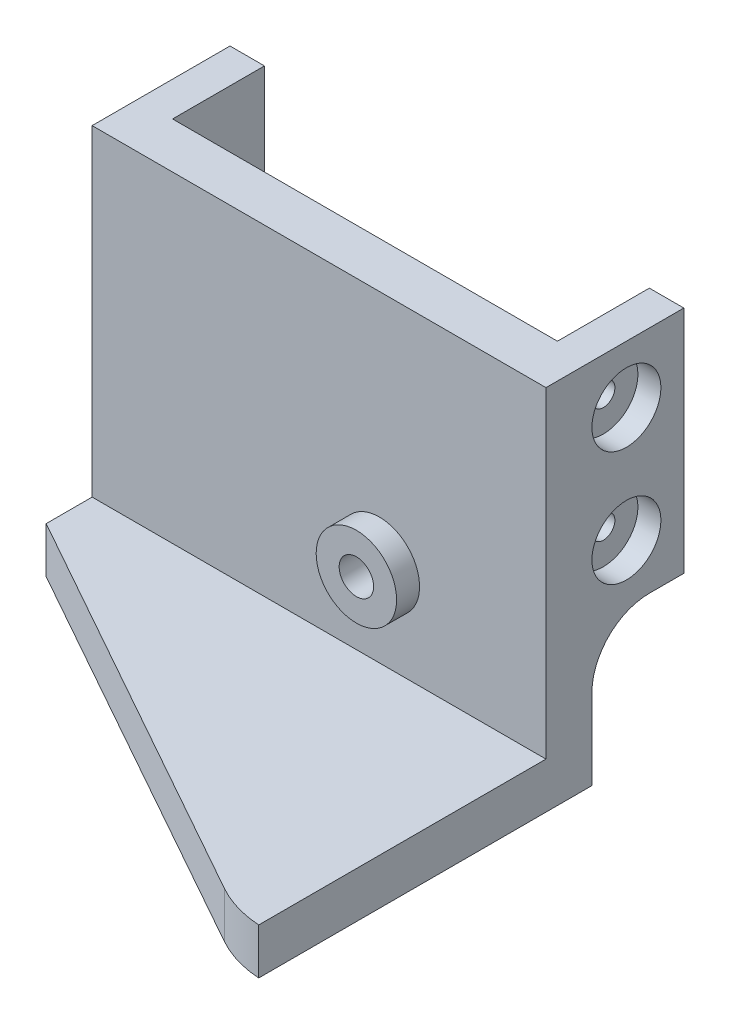
ISO-10303-21;
HEADER;
FILE_DESCRIPTION(('STEP AP214'),'2;1');
FILE_NAME('part.step','',(''),(''),'','','');
FILE_SCHEMA(('AUTOMOTIVE_DESIGN { 1 0 10303 214 1 1 1 1 }'));
ENDSEC;
DATA;
#1=APPLICATION_CONTEXT('core data for automotive mechanical design processes');
#2=APPLICATION_PROTOCOL_DEFINITION('international standard','automotive_design',2000,#1);
#3=PRODUCT_CONTEXT('',#1,'mechanical');
#4=PRODUCT('Part','Part','',(#3));
#5=PRODUCT_RELATED_PRODUCT_CATEGORY('part','',(#4));
#6=PRODUCT_DEFINITION_FORMATION('','',#4);
#7=PRODUCT_DEFINITION_CONTEXT('part definition',#1,'design');
#8=PRODUCT_DEFINITION('design','',#6,#7);
#9=PRODUCT_DEFINITION_SHAPE('','',#8);
#10=(LENGTH_UNIT() NAMED_UNIT(*) SI_UNIT(.MILLI.,.METRE.));
#11=(NAMED_UNIT(*) PLANE_ANGLE_UNIT() SI_UNIT($,.RADIAN.));
#12=(NAMED_UNIT(*) SI_UNIT($,.STERADIAN.) SOLID_ANGLE_UNIT());
#13=UNCERTAINTY_MEASURE_WITH_UNIT(LENGTH_MEASURE(1.E-05),#10,'distance_accuracy_value','');
#14=(GEOMETRIC_REPRESENTATION_CONTEXT(3) GLOBAL_UNCERTAINTY_ASSIGNED_CONTEXT((#13)) GLOBAL_UNIT_ASSIGNED_CONTEXT((#10,
#11,#12)) REPRESENTATION_CONTEXT('',''));
#15=CARTESIAN_POINT('',(0.,0.,0.));
#16=DIRECTION('',(0.,0.,1.));
#17=DIRECTION('',(1.,0.,0.));
#18=AXIS2_PLACEMENT_3D('',#15,#16,#17);
#19=CARTESIAN_POINT('',(37.5,20.,0.));
#20=DIRECTION('',(-1.,0.,0.));
#21=DIRECTION('',(0.,0.,1.));
#22=AXIS2_PLACEMENT_3D('',#19,#20,#21);
#23=PLANE('',#22);
#24=CARTESIAN_POINT('',(37.5,5.00000000000003,-6.99999999999992));
#25=DIRECTION('',(-1.,0.,0.));
#26=DIRECTION('',(0.,0.,1.));
#27=AXIS2_PLACEMENT_3D('',#24,#25,#26);
#28=CIRCLE('',#27,1.);
#29=CARTESIAN_POINT('',(37.5,5.00000000000003,-5.99999999999991));
#30=VERTEX_POINT('',#29);
#31=EDGE_CURVE('E205',#30,#30,#28,.T.);
#32=ORIENTED_EDGE('',*,*,#31,.T.);
#33=EDGE_LOOP('',(#32));
#34=FACE_BOUND('',#33,.T.);
#35=CARTESIAN_POINT('',(37.5,5.00000000000003,-6.9999999999999));
#36=DIRECTION('',(1.,0.,0.));
#37=DIRECTION('',(0.,0.,-1.));
#38=AXIS2_PLACEMENT_3D('',#35,#36,#37);
#39=CIRCLE('',#38,3.);
#40=CARTESIAN_POINT('',(37.5,5.00000000000003,-3.99999999999989));
#41=VERTEX_POINT('',#40);
#42=EDGE_CURVE('E196',#41,#41,#39,.T.);
#43=ORIENTED_EDGE('',*,*,#42,.T.);
#44=EDGE_LOOP('',(#43));
#45=FACE_BOUND('',#44,.T.);
#46=ADVANCED_FACE('F37',(#34,#45),#23,.F.);
#47=CARTESIAN_POINT('',(37.5,15.,-6.99999999999991));
#48=DIRECTION('',(-1.,0.,0.));
#49=DIRECTION('',(0.,0.,1.));
#50=AXIS2_PLACEMENT_3D('',#47,#48,#49);
#51=CIRCLE('',#50,1.);
#52=CARTESIAN_POINT('',(37.5,15.,-5.99999999999991));
#53=VERTEX_POINT('',#52);
#54=EDGE_CURVE('E214',#53,#53,#51,.T.);
#55=ORIENTED_EDGE('',*,*,#54,.T.);
#56=EDGE_LOOP('',(#55));
#57=FACE_BOUND('',#56,.T.);
#58=CARTESIAN_POINT('',(37.5,15.,-6.9999999999999));
#59=DIRECTION('',(1.,0.,0.));
#60=DIRECTION('',(0.,0.,-1.));
#61=AXIS2_PLACEMENT_3D('',#58,#59,#60);
#62=CIRCLE('',#61,3.);
#63=CARTESIAN_POINT('',(37.5,15.,-3.99999999999989));
#64=VERTEX_POINT('',#63);
#65=EDGE_CURVE('E199',#64,#64,#62,.T.);
#66=ORIENTED_EDGE('',*,*,#65,.T.);
#67=EDGE_LOOP('',(#66));
#68=FACE_BOUND('',#67,.T.);
#69=ADVANCED_FACE('F370',(#57,#68),#23,.F.);
#70=CARTESIAN_POINT('',(0.,0.,0.));
#71=DIRECTION('',(0.,1.,0.));
#72=DIRECTION('',(0.,0.,1.));
#73=AXIS2_PLACEMENT_3D('',#70,#71,#72);
#74=PLANE('',#73);
#75=DIRECTION('',(0.,0.,1.));
#76=VECTOR('',#75,1.);
#77=CARTESIAN_POINT('',(3.,0.,0.));
#78=LINE('',#77,#76);
#79=CARTESIAN_POINT('',(3.,0.,-12.));
#80=VERTEX_POINT('',#79);
#81=CARTESIAN_POINT('',(3.,0.,-9.));
#82=VERTEX_POINT('',#81);
#83=EDGE_CURVE('E266',#80,#82,#78,.T.);
#84=ORIENTED_EDGE('',*,*,#83,.T.);
#85=DIRECTION('',(1.,0.,0.));
#86=VECTOR('',#85,1.);
#87=CARTESIAN_POINT('',(0.,0.,-9.));
#88=LINE('',#87,#86);
#89=CARTESIAN_POINT('',(0.,0.,-9.));
#90=VERTEX_POINT('',#89);
#91=EDGE_CURVE('E287',#82,#90,#88,.F.);
#92=ORIENTED_EDGE('',*,*,#91,.T.);
#93=DIRECTION('',(0.,0.,-1.));
#94=VECTOR('',#93,1.);
#95=CARTESIAN_POINT('',(0.,0.,0.));
#96=LINE('',#95,#94);
#97=CARTESIAN_POINT('',(0.,0.,-12.));
#98=VERTEX_POINT('',#97);
#99=EDGE_CURVE('E251',#90,#98,#96,.T.);
#100=ORIENTED_EDGE('',*,*,#99,.T.);
#101=DIRECTION('',(1.,0.,0.));
#102=VECTOR('',#101,1.);
#103=CARTESIAN_POINT('',(0.,0.,-12.));
#104=LINE('',#103,#102);
#105=EDGE_CURVE('E263',#98,#80,#104,.T.);
#106=ORIENTED_EDGE('',*,*,#105,.T.);
#107=EDGE_LOOP('',(#84,#92,#100,#106));
#108=FACE_BOUND('',#107,.T.);
#109=ADVANCED_FACE('F333',(#108),#74,.F.);
#110=CARTESIAN_POINT('',(36.5,0.,-12.));
#111=VERTEX_POINT('',#110);
#112=CARTESIAN_POINT('',(39.5,0.,-12.));
#113=VERTEX_POINT('',#112);
#114=EDGE_CURVE('E247',#111,#113,#104,.T.);
#115=ORIENTED_EDGE('',*,*,#114,.T.);
#116=DIRECTION('',(0.,0.,-1.));
#117=VECTOR('',#116,1.);
#118=CARTESIAN_POINT('',(39.5,0.,0.));
#119=LINE('',#118,#117);
#120=CARTESIAN_POINT('',(39.5,0.,-8.99999999999998));
#121=VERTEX_POINT('',#120);
#122=EDGE_CURVE('E192',#121,#113,#119,.T.);
#123=ORIENTED_EDGE('',*,*,#122,.F.);
#124=DIRECTION('',(1.,0.,0.));
#125=VECTOR('',#124,1.);
#126=CARTESIAN_POINT('',(0.,0.,-9.));
#127=LINE('',#126,#125);
#128=CARTESIAN_POINT('',(36.5,0.,-9.));
#129=VERTEX_POINT('',#128);
#130=EDGE_CURVE('E289',#121,#129,#127,.F.);
#131=ORIENTED_EDGE('',*,*,#130,.T.);
#132=DIRECTION('',(0.,0.,1.));
#133=VECTOR('',#132,1.);
#134=CARTESIAN_POINT('',(36.5,0.,0.));
#135=LINE('',#134,#133);
#136=EDGE_CURVE('E262',#111,#129,#135,.T.);
#137=ORIENTED_EDGE('',*,*,#136,.F.);
#138=EDGE_LOOP('',(#115,#123,#131,#137));
#139=FACE_BOUND('',#138,.T.);
#140=ADVANCED_FACE('F352',(#139),#74,.F.);
#141=CARTESIAN_POINT('',(0.,20.,-12.));
#142=DIRECTION('',(0.,0.,-1.));
#143=DIRECTION('',(-1.,0.,0.));
#144=AXIS2_PLACEMENT_3D('',#141,#142,#143);
#145=PLANE('',#144);
#146=ORIENTED_EDGE('',*,*,#114,.F.);
#147=DIRECTION('',(0.,-1.,0.));
#148=VECTOR('',#147,1.);
#149=CARTESIAN_POINT('',(36.5,20.,-12.));
#150=LINE('',#149,#148);
#151=CARTESIAN_POINT('',(36.5,20.,-12.));
#152=VERTEX_POINT('',#151);
#153=EDGE_CURVE('E280',#152,#111,#150,.T.);
#154=ORIENTED_EDGE('',*,*,#153,.F.);
#155=DIRECTION('',(1.,0.,0.));
#156=VECTOR('',#155,1.);
#157=CARTESIAN_POINT('',(0.,20.,-12.));
#158=LINE('',#157,#156);
#159=CARTESIAN_POINT('',(39.5,20.,-12.));
#160=VERTEX_POINT('',#159);
#161=EDGE_CURVE('E248',#152,#160,#158,.T.);
#162=ORIENTED_EDGE('',*,*,#161,.T.);
#163=DIRECTION('',(0.,1.,0.));
#164=VECTOR('',#163,1.);
#165=CARTESIAN_POINT('',(39.5,0.,-12.));
#166=LINE('',#165,#164);
#167=EDGE_CURVE('E172',#113,#160,#166,.T.);
#168=ORIENTED_EDGE('',*,*,#167,.F.);
#169=EDGE_LOOP('',(#146,#154,#162,#168));
#170=FACE_BOUND('',#169,.T.);
#171=ADVANCED_FACE('F355',(#170),#145,.T.);
#172=CARTESIAN_POINT('',(36.5,20.,0.));
#173=DIRECTION('',(1.,0.,0.));
#174=DIRECTION('',(0.,0.,-1.));
#175=AXIS2_PLACEMENT_3D('',#172,#173,#174);
#176=PLANE('',#175);
#177=CARTESIAN_POINT('',(36.5,15.,-6.99999999999991));
#178=DIRECTION('',(1.,0.,0.));
#179=DIRECTION('',(0.,0.,-1.));
#180=AXIS2_PLACEMENT_3D('',#177,#178,#179);
#181=CIRCLE('',#180,1.);
#182=CARTESIAN_POINT('',(36.5,15.,-7.99999999999992));
#183=VERTEX_POINT('',#182);
#184=EDGE_CURVE('E218',#183,#183,#181,.T.);
#185=ORIENTED_EDGE('',*,*,#184,.T.);
#186=EDGE_LOOP('',(#185));
#187=FACE_BOUND('',#186,.T.);
#188=CARTESIAN_POINT('',(36.5,5.00000000000003,-6.99999999999992));
#189=DIRECTION('',(1.,0.,0.));
#190=DIRECTION('',(0.,0.,-1.));
#191=AXIS2_PLACEMENT_3D('',#188,#189,#190);
#192=CIRCLE('',#191,1.);
#193=CARTESIAN_POINT('',(36.5,5.00000000000003,-7.99999999999992));
#194=VERTEX_POINT('',#193);
#195=EDGE_CURVE('E211',#194,#194,#192,.T.);
#196=ORIENTED_EDGE('',*,*,#195,.T.);
#197=EDGE_LOOP('',(#196));
#198=FACE_BOUND('',#197,.T.);
#199=ORIENTED_EDGE('',*,*,#136,.T.);
#200=CARTESIAN_POINT('',(36.5,-5.,-9.));
#201=DIRECTION('',(1.,0.,0.));
#202=DIRECTION('',(0.,0.,-1.));
#203=AXIS2_PLACEMENT_3D('',#200,#201,#202);
#204=CIRCLE('',#203,5.);
#205=CARTESIAN_POINT('',(36.5,-5.,-4.));
#206=VERTEX_POINT('',#205);
#207=EDGE_CURVE('E295',#129,#206,#204,.T.);
#208=ORIENTED_EDGE('',*,*,#207,.T.);
#209=DIRECTION('',(0.,-1.,0.));
#210=VECTOR('',#209,1.);
#211=CARTESIAN_POINT('',(36.5,20.,-4.));
#212=LINE('',#211,#210);
#213=CARTESIAN_POINT('',(36.5,20.,-4.));
#214=VERTEX_POINT('',#213);
#215=EDGE_CURVE('E278',#214,#206,#212,.T.);
#216=ORIENTED_EDGE('',*,*,#215,.F.);
#217=DIRECTION('',(0.,0.,1.));
#218=VECTOR('',#217,1.);
#219=CARTESIAN_POINT('',(36.5,20.,0.));
#220=LINE('',#219,#218);
#221=EDGE_CURVE('E250',#152,#214,#220,.T.);
#222=ORIENTED_EDGE('',*,*,#221,.F.);
#223=ORIENTED_EDGE('',*,*,#153,.T.);
#224=EDGE_LOOP('',(#199,#208,#216,#222,#223));
#225=FACE_BOUND('',#224,.T.);
#226=ADVANCED_FACE('F345',(#187,#198,#225),#176,.F.);
#227=CARTESIAN_POINT('',(0.,20.,-4.));
#228=DIRECTION('',(0.,0.,-1.));
#229=DIRECTION('',(-1.,0.,0.));
#230=AXIS2_PLACEMENT_3D('',#227,#228,#229);
#231=PLANE('',#230);
#232=CARTESIAN_POINT('',(25.,-0.5,-4.));
#233=DIRECTION('',(0.,0.,-1.));
#234=DIRECTION('',(-1.,0.,0.));
#235=AXIS2_PLACEMENT_3D('',#232,#233,#234);
#236=CIRCLE('',#235,1.5);
#237=CARTESIAN_POINT('',(23.5,-0.5,-4.));
#238=VERTEX_POINT('',#237);
#239=EDGE_CURVE('E228',#238,#238,#236,.T.);
#240=ORIENTED_EDGE('',*,*,#239,.F.);
#241=EDGE_LOOP('',(#240));
#242=FACE_BOUND('',#241,.T.);
#243=DIRECTION('',(0.,1.,0.));
#244=VECTOR('',#243,1.);
#245=CARTESIAN_POINT('',(0.,-12.,-4.));
#246=LINE('',#245,#244);
#247=CARTESIAN_POINT('',(0.,-12.,-4.));
#248=VERTEX_POINT('',#247);
#249=CARTESIAN_POINT('',(0.,-5.,-4.));
#250=VERTEX_POINT('',#249);
#251=EDGE_CURVE('E244',#248,#250,#246,.T.);
#252=ORIENTED_EDGE('',*,*,#251,.T.);
#253=DIRECTION('',(1.,0.,0.));
#254=VECTOR('',#253,1.);
#255=CARTESIAN_POINT('',(0.,-5.,-4.));
#256=LINE('',#255,#254);
#257=CARTESIAN_POINT('',(3.,-5.,-4.));
#258=VERTEX_POINT('',#257);
#259=EDGE_CURVE('E284',#250,#258,#256,.T.);
#260=ORIENTED_EDGE('',*,*,#259,.T.);
#261=DIRECTION('',(0.,-1.,0.));
#262=VECTOR('',#261,1.);
#263=CARTESIAN_POINT('',(3.,20.,-4.));
#264=LINE('',#263,#262);
#265=CARTESIAN_POINT('',(3.,20.,-4.));
#266=VERTEX_POINT('',#265);
#267=EDGE_CURVE('E276',#266,#258,#264,.T.);
#268=ORIENTED_EDGE('',*,*,#267,.F.);
#269=DIRECTION('',(1.,0.,0.));
#270=VECTOR('',#269,1.);
#271=CARTESIAN_POINT('',(0.,20.,-4.));
#272=LINE('',#271,#270);
#273=EDGE_CURVE('E254',#266,#214,#272,.T.);
#274=ORIENTED_EDGE('',*,*,#273,.T.);
#275=ORIENTED_EDGE('',*,*,#215,.T.);
#276=DIRECTION('',(1.,0.,0.));
#277=VECTOR('',#276,1.);
#278=CARTESIAN_POINT('',(0.,-5.,-4.));
#279=LINE('',#278,#277);
#280=CARTESIAN_POINT('',(39.5,-5.,-3.99999999999998));
#281=VERTEX_POINT('',#280);
#282=EDGE_CURVE('E282',#206,#281,#279,.T.);
#283=ORIENTED_EDGE('',*,*,#282,.T.);
#284=DIRECTION('',(0.,1.,0.));
#285=VECTOR('',#284,1.);
#286=CARTESIAN_POINT('',(39.5,0.,-3.99999999999998));
#287=LINE('',#286,#285);
#288=CARTESIAN_POINT('',(39.5,-12.,-3.99999999999998));
#289=VERTEX_POINT('',#288);
#290=EDGE_CURVE('E186',#289,#281,#287,.T.);
#291=ORIENTED_EDGE('',*,*,#290,.F.);
#292=DIRECTION('',(1.,0.,0.));
#293=VECTOR('',#292,1.);
#294=CARTESIAN_POINT('',(0.,-12.,-4.));
#295=LINE('',#294,#293);
#296=EDGE_CURVE('E242',#248,#289,#295,.T.);
#297=ORIENTED_EDGE('',*,*,#296,.F.);
#298=EDGE_LOOP('',(#252,#260,#268,#274,#275,#283,#291,#297));
#299=FACE_BOUND('',#298,.T.);
#300=ADVANCED_FACE('F322',(#242,#299),#231,.T.);
#301=CARTESIAN_POINT('',(3.,20.,0.));
#302=DIRECTION('',(1.,0.,0.));
#303=DIRECTION('',(0.,0.,-1.));
#304=AXIS2_PLACEMENT_3D('',#301,#302,#303);
#305=PLANE('',#304);
#306=CARTESIAN_POINT('',(3.,15.,-6.99999999999991));
#307=DIRECTION('',(1.,0.,0.));
#308=DIRECTION('',(0.,0.,-1.));
#309=AXIS2_PLACEMENT_3D('',#306,#307,#308);
#310=CIRCLE('',#309,1.);
#311=CARTESIAN_POINT('',(3.,15.,-7.99999999999992));
#312=VERTEX_POINT('',#311);
#313=EDGE_CURVE('E215',#312,#312,#310,.T.);
#314=ORIENTED_EDGE('',*,*,#313,.F.);
#315=EDGE_LOOP('',(#314));
#316=FACE_BOUND('',#315,.T.);
#317=CARTESIAN_POINT('',(3.,5.00000000000003,-6.99999999999992));
#318=DIRECTION('',(1.,0.,0.));
#319=DIRECTION('',(0.,0.,-1.));
#320=AXIS2_PLACEMENT_3D('',#317,#318,#319);
#321=CIRCLE('',#320,1.);
#322=CARTESIAN_POINT('',(3.,5.00000000000003,-7.99999999999992));
#323=VERTEX_POINT('',#322);
#324=EDGE_CURVE('E208',#323,#323,#321,.T.);
#325=ORIENTED_EDGE('',*,*,#324,.F.);
#326=EDGE_LOOP('',(#325));
#327=FACE_BOUND('',#326,.T.);
#328=ORIENTED_EDGE('',*,*,#83,.F.);
#329=DIRECTION('',(0.,-1.,0.));
#330=VECTOR('',#329,1.);
#331=CARTESIAN_POINT('',(3.,20.,-12.));
#332=LINE('',#331,#330);
#333=CARTESIAN_POINT('',(3.,20.,-12.));
#334=VERTEX_POINT('',#333);
#335=EDGE_CURVE('E274',#334,#80,#332,.T.);
#336=ORIENTED_EDGE('',*,*,#335,.F.);
#337=DIRECTION('',(0.,0.,1.));
#338=VECTOR('',#337,1.);
#339=CARTESIAN_POINT('',(3.,20.,0.));
#340=LINE('',#339,#338);
#341=EDGE_CURVE('E257',#334,#266,#340,.T.);
#342=ORIENTED_EDGE('',*,*,#341,.T.);
#343=ORIENTED_EDGE('',*,*,#267,.T.);
#344=CARTESIAN_POINT('',(3.,-5.,-9.));
#345=DIRECTION('',(1.,0.,0.));
#346=DIRECTION('',(0.,0.,-1.));
#347=AXIS2_PLACEMENT_3D('',#344,#345,#346);
#348=CIRCLE('',#347,5.);
#349=EDGE_CURVE('E291',#258,#82,#348,.F.);
#350=ORIENTED_EDGE('',*,*,#349,.T.);
#351=EDGE_LOOP('',(#328,#336,#342,#343,#350));
#352=FACE_BOUND('',#351,.T.);
#353=ADVANCED_FACE('F330',(#316,#327,#352),#305,.T.);
#354=ORIENTED_EDGE('',*,*,#105,.F.);
#355=DIRECTION('',(0.,-1.,0.));
#356=VECTOR('',#355,1.);
#357=CARTESIAN_POINT('',(0.,20.,-12.));
#358=LINE('',#357,#356);
#359=CARTESIAN_POINT('',(0.,20.,-12.));
#360=VERTEX_POINT('',#359);
#361=EDGE_CURVE('E271',#360,#98,#358,.T.);
#362=ORIENTED_EDGE('',*,*,#361,.F.);
#363=EDGE_CURVE('E252',#360,#334,#158,.T.);
#364=ORIENTED_EDGE('',*,*,#363,.T.);
#365=ORIENTED_EDGE('',*,*,#335,.T.);
#366=EDGE_LOOP('',(#354,#362,#364,#365));
#367=FACE_BOUND('',#366,.T.);
#368=ADVANCED_FACE('F336',(#367),#145,.T.);
#369=CARTESIAN_POINT('',(0.,20.,0.));
#370=DIRECTION('',(-1.,0.,0.));
#371=DIRECTION('',(0.,0.,1.));
#372=AXIS2_PLACEMENT_3D('',#369,#370,#371);
#373=PLANE('',#372);
#374=CARTESIAN_POINT('',(0.,15.,-6.99999999999991));
#375=DIRECTION('',(1.,0.,0.));
#376=DIRECTION('',(0.,0.,-1.));
#377=AXIS2_PLACEMENT_3D('',#374,#375,#376);
#378=CIRCLE('',#377,1.);
#379=CARTESIAN_POINT('',(0.,15.,-7.99999999999992));
#380=VERTEX_POINT('',#379);
#381=EDGE_CURVE('E202',#380,#380,#378,.T.);
#382=ORIENTED_EDGE('',*,*,#381,.T.);
#383=EDGE_LOOP('',(#382));
#384=FACE_BOUND('',#383,.T.);
#385=CARTESIAN_POINT('',(0.,5.00000000000003,-6.99999999999992));
#386=DIRECTION('',(1.,0.,0.));
#387=DIRECTION('',(0.,0.,-1.));
#388=AXIS2_PLACEMENT_3D('',#385,#386,#387);
#389=CIRCLE('',#388,1.);
#390=CARTESIAN_POINT('',(0.,5.00000000000003,-7.99999999999992));
#391=VERTEX_POINT('',#390);
#392=EDGE_CURVE('E195',#391,#391,#389,.T.);
#393=ORIENTED_EDGE('',*,*,#392,.T.);
#394=EDGE_LOOP('',(#393));
#395=FACE_BOUND('',#394,.T.);
#396=DIRECTION('',(0.,1.,0.));
#397=VECTOR('',#396,1.);
#398=CARTESIAN_POINT('',(0.,-18.,4.));
#399=LINE('',#398,#397);
#400=CARTESIAN_POINT('',(0.,-12.,4.));
#401=VERTEX_POINT('',#400);
#402=CARTESIAN_POINT('',(0.,-8.,4.));
#403=VERTEX_POINT('',#402);
#404=EDGE_CURVE('E223',#401,#403,#399,.T.);
#405=ORIENTED_EDGE('',*,*,#404,.T.);
#406=DIRECTION('',(0.,0.,-1.));
#407=VECTOR('',#406,1.);
#408=CARTESIAN_POINT('',(0.,-8.,25.));
#409=LINE('',#408,#407);
#410=CARTESIAN_POINT('',(0.,-8.,0.));
#411=VERTEX_POINT('',#410);
#412=EDGE_CURVE('E238',#403,#411,#409,.T.);
#413=ORIENTED_EDGE('',*,*,#412,.T.);
#414=DIRECTION('',(0.,-1.,0.));
#415=VECTOR('',#414,1.);
#416=CARTESIAN_POINT('',(0.,20.,0.));
#417=LINE('',#416,#415);
#418=CARTESIAN_POINT('',(0.,20.,0.));
#419=VERTEX_POINT('',#418);
#420=EDGE_CURVE('E156',#419,#411,#417,.T.);
#421=ORIENTED_EDGE('',*,*,#420,.F.);
#422=DIRECTION('',(0.,0.,-1.));
#423=VECTOR('',#422,1.);
#424=CARTESIAN_POINT('',(0.,20.,0.));
#425=LINE('',#424,#423);
#426=EDGE_CURVE('E153',#419,#360,#425,.T.);
#427=ORIENTED_EDGE('',*,*,#426,.T.);
#428=ORIENTED_EDGE('',*,*,#361,.T.);
#429=ORIENTED_EDGE('',*,*,#99,.F.);
#430=CARTESIAN_POINT('',(0.,-5.,-9.));
#431=DIRECTION('',(-1.,0.,0.));
#432=DIRECTION('',(0.,0.,1.));
#433=AXIS2_PLACEMENT_3D('',#430,#431,#432);
#434=CIRCLE('',#433,5.);
#435=EDGE_CURVE('E293',#90,#250,#434,.F.);
#436=ORIENTED_EDGE('',*,*,#435,.T.);
#437=ORIENTED_EDGE('',*,*,#251,.F.);
#438=DIRECTION('',(0.,0.,-1.));
#439=VECTOR('',#438,1.);
#440=CARTESIAN_POINT('',(0.,-12.,0.));
#441=LINE('',#440,#439);
#442=EDGE_CURVE('E240',#401,#248,#441,.T.);
#443=ORIENTED_EDGE('',*,*,#442,.F.);
#444=EDGE_LOOP('',(#405,#413,#421,#427,#428,#429,#436,#437,#443));
#445=FACE_BOUND('',#444,.T.);
#446=ADVANCED_FACE('F317',(#384,#395,#445),#373,.T.);
#447=CARTESIAN_POINT('',(0.,20.,0.));
#448=DIRECTION('',(0.,0.,-1.));
#449=DIRECTION('',(-1.,0.,0.));
#450=AXIS2_PLACEMENT_3D('',#447,#448,#449);
#451=PLANE('',#450);
#452=CARTESIAN_POINT('',(25.,-0.5,0.));
#453=DIRECTION('',(0.,0.,-1.));
#454=DIRECTION('',(-1.,0.,0.));
#455=AXIS2_PLACEMENT_3D('',#452,#453,#454);
#456=CIRCLE('',#455,3.5);
#457=CARTESIAN_POINT('',(21.5,-0.5,0.));
#458=VERTEX_POINT('',#457);
#459=EDGE_CURVE('E298',#458,#458,#456,.F.);
#460=ORIENTED_EDGE('',*,*,#459,.F.);
#461=EDGE_LOOP('',(#460));
#462=FACE_BOUND('',#461,.T.);
#463=ORIENTED_EDGE('',*,*,#420,.T.);
#464=DIRECTION('',(1.,0.,0.));
#465=VECTOR('',#464,1.);
#466=CARTESIAN_POINT('',(0.,-8.,0.));
#467=LINE('',#466,#465);
#468=CARTESIAN_POINT('',(39.5,-8.00000000000001,0.));
#469=VERTEX_POINT('',#468);
#470=EDGE_CURVE('E162',#411,#469,#467,.T.);
#471=ORIENTED_EDGE('',*,*,#470,.T.);
#472=DIRECTION('',(0.,-1.,0.));
#473=VECTOR('',#472,1.);
#474=CARTESIAN_POINT('',(39.5,0.,0.));
#475=LINE('',#474,#473);
#476=CARTESIAN_POINT('',(39.5,20.,0.));
#477=VERTEX_POINT('',#476);
#478=EDGE_CURVE('E159',#477,#469,#475,.T.);
#479=ORIENTED_EDGE('',*,*,#478,.F.);
#480=DIRECTION('',(1.,0.,0.));
#481=VECTOR('',#480,1.);
#482=CARTESIAN_POINT('',(0.,20.,0.));
#483=LINE('',#482,#481);
#484=EDGE_CURVE('E145',#419,#477,#483,.T.);
#485=ORIENTED_EDGE('',*,*,#484,.F.);
#486=EDGE_LOOP('',(#463,#471,#479,#485));
#487=FACE_BOUND('',#486,.T.);
#488=ADVANCED_FACE('F160',(#462,#487),#451,.F.);
#489=CARTESIAN_POINT('',(0.,20.,0.));
#490=DIRECTION('',(0.,1.,0.));
#491=DIRECTION('',(0.,0.,1.));
#492=AXIS2_PLACEMENT_3D('',#489,#490,#491);
#493=PLANE('',#492);
#494=ORIENTED_EDGE('',*,*,#161,.F.);
#495=ORIENTED_EDGE('',*,*,#221,.T.);
#496=ORIENTED_EDGE('',*,*,#273,.F.);
#497=ORIENTED_EDGE('',*,*,#341,.F.);
#498=ORIENTED_EDGE('',*,*,#363,.F.);
#499=ORIENTED_EDGE('',*,*,#426,.F.);
#500=ORIENTED_EDGE('',*,*,#484,.T.);
#501=DIRECTION('',(0.,0.,1.));
#502=VECTOR('',#501,1.);
#503=CARTESIAN_POINT('',(39.5,20.,0.));
#504=LINE('',#503,#502);
#505=EDGE_CURVE('E150',#160,#477,#504,.T.);
#506=ORIENTED_EDGE('',*,*,#505,.F.);
#507=EDGE_LOOP('',(#494,#495,#496,#497,#498,#499,#500,#506));
#508=FACE_BOUND('',#507,.T.);
#509=ADVANCED_FACE('F148',(#508),#493,.T.);
#510=CARTESIAN_POINT('',(0.,-12.,0.));
#511=DIRECTION('',(0.,-1.,0.));
#512=DIRECTION('',(0.,0.,-1.));
#513=AXIS2_PLACEMENT_3D('',#510,#511,#512);
#514=PLANE('',#513);
#515=DIRECTION('',(0.,0.,-1.));
#516=VECTOR('',#515,1.);
#517=CARTESIAN_POINT('',(39.5,-12.,0.));
#518=LINE('',#517,#516);
#519=CARTESIAN_POINT('',(39.5,-12.,25.));
#520=VERTEX_POINT('',#519);
#521=EDGE_CURVE('E183',#520,#289,#518,.T.);
#522=ORIENTED_EDGE('',*,*,#521,.F.);
#523=CARTESIAN_POINT('',(40.1467403468371,-12.,15.0209355687132));
#524=DIRECTION('',(0.,-1.,0.));
#525=DIRECTION('',(0.,0.,-1.));
#526=AXIS2_PLACEMENT_3D('',#523,#524,#525);
#527=CIRCLE('',#526,10.);
#528=CARTESIAN_POINT('',(35.2607066575186,-12.,23.7459957282104));
#529=VERTEX_POINT('',#528);
#530=EDGE_CURVE('E11',#520,#529,#527,.T.);
#531=ORIENTED_EDGE('',*,*,#530,.T.);
#532=DIRECTION('',(0.87250601594972,0.,0.488603368931843));
#533=VECTOR('',#532,1.);
#534=CARTESIAN_POINT('',(-1.70523751522534,-12.,3.04506699147381));
#535=LINE('',#534,#533);
#536=EDGE_CURVE('E226',#401,#529,#535,.T.);
#537=ORIENTED_EDGE('',*,*,#536,.F.);
#538=ORIENTED_EDGE('',*,*,#442,.T.);
#539=ORIENTED_EDGE('',*,*,#296,.T.);
#540=EDGE_LOOP('',(#522,#531,#537,#538,#539));
#541=FACE_BOUND('',#540,.T.);
#542=ADVANCED_FACE('F313',(#541),#514,.T.);
#543=CARTESIAN_POINT('',(0.,-5.,-9.));
#544=DIRECTION('',(1.,0.,0.));
#545=DIRECTION('',(0.,0.,-1.));
#546=AXIS2_PLACEMENT_3D('',#543,#544,#545);
#547=CYLINDRICAL_SURFACE('',#546,5.);
#548=ORIENTED_EDGE('',*,*,#435,.F.);
#549=ORIENTED_EDGE('',*,*,#91,.F.);
#550=ORIENTED_EDGE('',*,*,#349,.F.);
#551=ORIENTED_EDGE('',*,*,#259,.F.);
#552=EDGE_LOOP('',(#548,#549,#550,#551));
#553=FACE_BOUND('',#552,.T.);
#554=ADVANCED_FACE('F326',(#553),#547,.F.);
#555=CARTESIAN_POINT('',(0.,-5.,-9.));
#556=DIRECTION('',(1.,0.,0.));
#557=DIRECTION('',(0.,0.,-1.));
#558=AXIS2_PLACEMENT_3D('',#555,#556,#557);
#559=CYLINDRICAL_SURFACE('',#558,5.);
#560=ORIENTED_EDGE('',*,*,#207,.F.);
#561=ORIENTED_EDGE('',*,*,#130,.F.);
#562=CARTESIAN_POINT('',(39.5,-5.,-8.99999999999998));
#563=DIRECTION('',(1.,0.,0.));
#564=DIRECTION('',(0.,0.,-1.));
#565=AXIS2_PLACEMENT_3D('',#562,#563,#564);
#566=CIRCLE('',#565,5.);
#567=EDGE_CURVE('E189',#281,#121,#566,.F.);
#568=ORIENTED_EDGE('',*,*,#567,.F.);
#569=ORIENTED_EDGE('',*,*,#282,.F.);
#570=EDGE_LOOP('',(#560,#561,#568,#569));
#571=FACE_BOUND('',#570,.T.);
#572=ADVANCED_FACE('F349',(#571),#559,.F.);
#573=CARTESIAN_POINT('',(0.,-8.,25.));
#574=DIRECTION('',(0.,1.,0.));
#575=DIRECTION('',(0.,0.,1.));
#576=AXIS2_PLACEMENT_3D('',#573,#574,#575);
#577=PLANE('',#576);
#578=DIRECTION('',(-0.87250601594972,0.,-0.488603368931843));
#579=VECTOR('',#578,1.);
#580=CARTESIAN_POINT('',(37.5,-8.,25.));
#581=LINE('',#580,#579);
#582=CARTESIAN_POINT('',(35.2607066575186,-8.,23.7459957282104));
#583=VERTEX_POINT('',#582);
#584=EDGE_CURVE('E221',#583,#403,#581,.T.);
#585=ORIENTED_EDGE('',*,*,#584,.F.);
#586=CARTESIAN_POINT('',(40.1467403468371,-8.,15.0209355687132));
#587=DIRECTION('',(0.,1.,0.));
#588=DIRECTION('',(0.,0.,1.));
#589=AXIS2_PLACEMENT_3D('',#586,#587,#588);
#590=CIRCLE('',#589,10.);
#591=CARTESIAN_POINT('',(39.5,-8.00000000000001,25.));
#592=VERTEX_POINT('',#591);
#593=EDGE_CURVE('E45',#583,#592,#590,.T.);
#594=ORIENTED_EDGE('',*,*,#593,.T.);
#595=DIRECTION('',(0.,0.,1.));
#596=VECTOR('',#595,1.);
#597=CARTESIAN_POINT('',(39.5,-8.00000000000001,0.));
#598=LINE('',#597,#596);
#599=EDGE_CURVE('E166',#469,#592,#598,.T.);
#600=ORIENTED_EDGE('',*,*,#599,.F.);
#601=ORIENTED_EDGE('',*,*,#470,.F.);
#602=ORIENTED_EDGE('',*,*,#412,.F.);
#603=EDGE_LOOP('',(#585,#594,#600,#601,#602));
#604=FACE_BOUND('',#603,.T.);
#605=ADVANCED_FACE('F308',(#604),#577,.T.);
#606=CARTESIAN_POINT('',(25.,-0.5,2.));
#607=DIRECTION('',(0.,0.,1.));
#608=DIRECTION('',(1.,0.,0.));
#609=AXIS2_PLACEMENT_3D('',#606,#607,#608);
#610=PLANE('',#609);
#611=CARTESIAN_POINT('',(25.,-0.5,2.));
#612=DIRECTION('',(0.,0.,1.));
#613=DIRECTION('',(1.,0.,0.));
#614=AXIS2_PLACEMENT_3D('',#611,#612,#613);
#615=CIRCLE('',#614,3.5);
#616=CARTESIAN_POINT('',(28.5,-0.5,2.));
#617=VERTEX_POINT('',#616);
#618=EDGE_CURVE('E234',#617,#617,#615,.T.);
#619=ORIENTED_EDGE('',*,*,#618,.T.);
#620=EDGE_LOOP('',(#619));
#621=FACE_BOUND('',#620,.T.);
#622=CARTESIAN_POINT('',(25.,-0.5,2.));
#623=DIRECTION('',(0.,0.,1.));
#624=DIRECTION('',(1.,0.,0.));
#625=AXIS2_PLACEMENT_3D('',#622,#623,#624);
#626=CIRCLE('',#625,1.5);
#627=CARTESIAN_POINT('',(26.5,-0.5,2.));
#628=VERTEX_POINT('',#627);
#629=EDGE_CURVE('E231',#628,#628,#626,.T.);
#630=ORIENTED_EDGE('',*,*,#629,.F.);
#631=EDGE_LOOP('',(#630));
#632=FACE_BOUND('',#631,.T.);
#633=ADVANCED_FACE('F427',(#621,#632),#610,.T.);
#634=CARTESIAN_POINT('',(25.,-0.5,2.));
#635=DIRECTION('',(0.,0.,-1.));
#636=DIRECTION('',(-1.,0.,0.));
#637=AXIS2_PLACEMENT_3D('',#634,#635,#636);
#638=CYLINDRICAL_SURFACE('',#637,3.5);
#639=ORIENTED_EDGE('',*,*,#618,.F.);
#640=EDGE_LOOP('',(#639));
#641=FACE_BOUND('',#640,.T.);
#642=ORIENTED_EDGE('',*,*,#459,.T.);
#643=EDGE_LOOP('',(#642));
#644=FACE_BOUND('',#643,.T.);
#645=ADVANCED_FACE('F423',(#641,#644),#638,.T.);
#646=CARTESIAN_POINT('',(25.,-0.5,2.));
#647=DIRECTION('',(0.,0.,-1.));
#648=DIRECTION('',(-1.,0.,0.));
#649=AXIS2_PLACEMENT_3D('',#646,#647,#648);
#650=CYLINDRICAL_SURFACE('',#649,1.5);
#651=ORIENTED_EDGE('',*,*,#629,.T.);
#652=EDGE_LOOP('',(#651));
#653=FACE_BOUND('',#652,.T.);
#654=ORIENTED_EDGE('',*,*,#239,.T.);
#655=EDGE_LOOP('',(#654));
#656=FACE_BOUND('',#655,.T.);
#657=ADVANCED_FACE('F414',(#653,#656),#650,.F.);
#658=CARTESIAN_POINT('',(37.5,-18.,25.));
#659=DIRECTION('',(0.488603368931843,0.,-0.87250601594972));
#660=DIRECTION('',(-0.87250601594972,0.,-0.488603368931843));
#661=AXIS2_PLACEMENT_3D('',#658,#659,#660);
#662=PLANE('',#661);
#663=ORIENTED_EDGE('',*,*,#536,.T.);
#664=DIRECTION('',(0.,-1.,0.));
#665=VECTOR('',#664,1.);
#666=CARTESIAN_POINT('',(35.2607066575186,-18.,23.7459957282104));
#667=LINE('',#666,#665);
#668=EDGE_CURVE('E301',#529,#583,#667,.F.);
#669=ORIENTED_EDGE('',*,*,#668,.T.);
#670=ORIENTED_EDGE('',*,*,#584,.T.);
#671=ORIENTED_EDGE('',*,*,#404,.F.);
#672=EDGE_LOOP('',(#663,#669,#670,#671));
#673=FACE_BOUND('',#672,.T.);
#674=ADVANCED_FACE('F311',(#673),#662,.F.);
#675=CARTESIAN_POINT('',(0.,5.00000000000003,-6.99999999999992));
#676=DIRECTION('',(1.,0.,0.));
#677=DIRECTION('',(0.,0.,-1.));
#678=AXIS2_PLACEMENT_3D('',#675,#676,#677);
#679=CYLINDRICAL_SURFACE('',#678,1.);
#680=ORIENTED_EDGE('',*,*,#31,.F.);
#681=EDGE_LOOP('',(#680));
#682=FACE_BOUND('',#681,.T.);
#683=ORIENTED_EDGE('',*,*,#195,.F.);
#684=EDGE_LOOP('',(#683));
#685=FACE_BOUND('',#684,.T.);
#686=ADVANCED_FACE('F398',(#682,#685),#679,.F.);
#687=CARTESIAN_POINT('',(0.,15.,-6.99999999999991));
#688=DIRECTION('',(1.,0.,0.));
#689=DIRECTION('',(0.,0.,-1.));
#690=AXIS2_PLACEMENT_3D('',#687,#688,#689);
#691=CYLINDRICAL_SURFACE('',#690,1.);
#692=ORIENTED_EDGE('',*,*,#54,.F.);
#693=EDGE_LOOP('',(#692));
#694=FACE_BOUND('',#693,.T.);
#695=ORIENTED_EDGE('',*,*,#184,.F.);
#696=EDGE_LOOP('',(#695));
#697=FACE_BOUND('',#696,.T.);
#698=ADVANCED_FACE('F395',(#694,#697),#691,.F.);
#699=ORIENTED_EDGE('',*,*,#324,.T.);
#700=EDGE_LOOP('',(#699));
#701=FACE_BOUND('',#700,.T.);
#702=ORIENTED_EDGE('',*,*,#392,.F.);
#703=EDGE_LOOP('',(#702));
#704=FACE_BOUND('',#703,.T.);
#705=ADVANCED_FACE('F392',(#701,#704),#679,.F.);
#706=ORIENTED_EDGE('',*,*,#313,.T.);
#707=EDGE_LOOP('',(#706));
#708=FACE_BOUND('',#707,.T.);
#709=ORIENTED_EDGE('',*,*,#381,.F.);
#710=EDGE_LOOP('',(#709));
#711=FACE_BOUND('',#710,.T.);
#712=ADVANCED_FACE('F394',(#708,#711),#691,.F.);
#713=CARTESIAN_POINT('',(39.5,15.,-6.9999999999999));
#714=DIRECTION('',(-1.,0.,0.));
#715=DIRECTION('',(0.,0.,1.));
#716=AXIS2_PLACEMENT_3D('',#713,#714,#715);
#717=CYLINDRICAL_SURFACE('',#716,3.);
#718=CARTESIAN_POINT('',(39.5,15.,-6.9999999999999));
#719=DIRECTION('',(1.,0.,0.));
#720=DIRECTION('',(0.,0.,-1.));
#721=AXIS2_PLACEMENT_3D('',#718,#719,#720);
#722=CIRCLE('',#721,3.);
#723=CARTESIAN_POINT('',(39.5,15.,-3.99999999999989));
#724=VERTEX_POINT('',#723);
#725=EDGE_CURVE('E173',#724,#724,#722,.T.);
#726=CARTESIAN_POINT('',(39.5,15.,-3.99999999999989));
#727=CARTESIAN_POINT('',(39.4791666666667,15.,-3.99999999999989));
#728=CARTESIAN_POINT('',(39.4583333333333,15.,-3.99999999999989));
#729=CARTESIAN_POINT('',(39.4166666666667,15.,-3.99999999999989));
#730=CARTESIAN_POINT('',(39.3958333333333,15.,-3.99999999999989));
#731=CARTESIAN_POINT('',(39.3541666666667,15.,-3.99999999999989));
#732=CARTESIAN_POINT('',(39.3333333333333,15.,-3.99999999999989));
#733=CARTESIAN_POINT('',(39.2916666666667,15.,-3.99999999999989));
#734=CARTESIAN_POINT('',(39.2708333333333,15.,-3.99999999999989));
#735=CARTESIAN_POINT('',(39.2291666666667,15.,-3.99999999999989));
#736=CARTESIAN_POINT('',(39.2083333333333,15.,-3.99999999999989));
#737=CARTESIAN_POINT('',(39.1666666666667,15.,-3.99999999999989));
#738=CARTESIAN_POINT('',(39.1458333333333,15.,-3.99999999999989));
#739=CARTESIAN_POINT('',(39.1041666666667,15.,-3.99999999999989));
#740=CARTESIAN_POINT('',(39.0833333333333,15.,-3.99999999999989));
#741=CARTESIAN_POINT('',(39.0416666666667,15.,-3.99999999999989));
#742=CARTESIAN_POINT('',(39.0208333333333,15.,-3.99999999999989));
#743=CARTESIAN_POINT('',(38.9791666666667,15.,-3.99999999999989));
#744=CARTESIAN_POINT('',(38.9583333333333,15.,-3.99999999999989));
#745=CARTESIAN_POINT('',(38.9166666666667,15.,-3.99999999999989));
#746=CARTESIAN_POINT('',(38.8958333333333,15.,-3.99999999999989));
#747=CARTESIAN_POINT('',(38.8541666666667,15.,-3.99999999999989));
#748=CARTESIAN_POINT('',(38.8333333333333,15.,-3.99999999999989));
#749=CARTESIAN_POINT('',(38.7916666666667,15.,-3.99999999999989));
#750=CARTESIAN_POINT('',(38.7708333333333,15.,-3.99999999999989));
#751=CARTESIAN_POINT('',(38.7291666666667,15.,-3.99999999999989));
#752=CARTESIAN_POINT('',(38.7083333333333,15.,-3.99999999999989));
#753=CARTESIAN_POINT('',(38.6666666666667,15.,-3.99999999999989));
#754=CARTESIAN_POINT('',(38.6458333333333,15.,-3.99999999999989));
#755=CARTESIAN_POINT('',(38.6041666666667,15.,-3.99999999999989));
#756=CARTESIAN_POINT('',(38.5833333333333,15.,-3.99999999999989));
#757=CARTESIAN_POINT('',(38.5416666666667,15.,-3.99999999999989));
#758=CARTESIAN_POINT('',(38.5208333333333,15.,-3.99999999999989));
#759=CARTESIAN_POINT('',(38.4791666666667,15.,-3.99999999999989));
#760=CARTESIAN_POINT('',(38.4583333333333,15.,-3.99999999999989));
#761=CARTESIAN_POINT('',(38.4166666666667,15.,-3.99999999999989));
#762=CARTESIAN_POINT('',(38.3958333333333,15.,-3.99999999999989));
#763=CARTESIAN_POINT('',(38.3541666666667,15.,-3.99999999999989));
#764=CARTESIAN_POINT('',(38.3333333333333,15.,-3.99999999999989));
#765=CARTESIAN_POINT('',(38.2916666666667,15.,-3.99999999999989));
#766=CARTESIAN_POINT('',(38.2708333333333,15.,-3.99999999999989));
#767=CARTESIAN_POINT('',(38.2291666666667,15.,-3.99999999999989));
#768=CARTESIAN_POINT('',(38.2083333333333,15.,-3.99999999999989));
#769=CARTESIAN_POINT('',(38.1666666666667,15.,-3.99999999999989));
#770=CARTESIAN_POINT('',(38.1458333333333,15.,-3.99999999999989));
#771=CARTESIAN_POINT('',(38.1041666666667,15.,-3.99999999999989));
#772=CARTESIAN_POINT('',(38.0833333333333,15.,-3.99999999999989));
#773=CARTESIAN_POINT('',(38.0416666666667,15.,-3.99999999999989));
#774=CARTESIAN_POINT('',(38.0208333333333,15.,-3.99999999999989));
#775=CARTESIAN_POINT('',(37.9791666666667,15.,-3.99999999999989));
#776=CARTESIAN_POINT('',(37.9583333333333,15.,-3.99999999999989));
#777=CARTESIAN_POINT('',(37.9166666666667,15.,-3.99999999999989));
#778=CARTESIAN_POINT('',(37.8958333333333,15.,-3.99999999999989));
#779=CARTESIAN_POINT('',(37.8541666666667,15.,-3.99999999999989));
#780=CARTESIAN_POINT('',(37.8333333333333,15.,-3.99999999999989));
#781=CARTESIAN_POINT('',(37.7916666666667,15.,-3.99999999999989));
#782=CARTESIAN_POINT('',(37.7708333333333,15.,-3.99999999999989));
#783=CARTESIAN_POINT('',(37.7291666666667,15.,-3.99999999999989));
#784=CARTESIAN_POINT('',(37.7083333333333,15.,-3.99999999999989));
#785=CARTESIAN_POINT('',(37.6666666666667,15.,-3.99999999999989));
#786=CARTESIAN_POINT('',(37.6458333333333,15.,-3.99999999999989));
#787=CARTESIAN_POINT('',(37.6041666666667,15.,-3.99999999999989));
#788=CARTESIAN_POINT('',(37.5833333333333,15.,-3.99999999999989));
#789=CARTESIAN_POINT('',(37.5416666666667,15.,-3.99999999999989));
#790=CARTESIAN_POINT('',(37.5208333333333,15.,-3.99999999999989));
#791=CARTESIAN_POINT('',(37.5,15.,-3.99999999999989));
#792=B_SPLINE_CURVE_WITH_KNOTS('',3,(#726,#727,#728,#729,#730,#731,#732,#733,#734,#735,#736,
#737,#738,#739,#740,#741,#742,#743,#744,#745,#746,#747,#748,#749,#750,#751,#752,#753,#754,#755,
#756,#757,#758,#759,#760,#761,#762,#763,#764,#765,#766,#767,#768,#769,#770,#771,#772,#773,#774,
#775,#776,#777,#778,#779,#780,#781,#782,#783,#784,#785,#786,#787,#788,#789,#790,#791),
.UNSPECIFIED.,.F.,.F.,(4,2,2,2,2,2,2,2,2,2,2,2,2,2,2,2,2,2,2,2,2,2,2,2,2,2,2,2,2,2,2,2,4),(0.,
0.062500000000007,0.125,0.187500000000007,0.25,0.312500000000007,0.375,0.437500000000007,0.5,
0.562500000000007,0.625000000000001,0.687500000000008,0.750000000000001,0.812500000000008,
0.875000000000001,0.937500000000008,1.,1.06250000000001,1.125,1.18750000000001,1.25,
1.31250000000001,1.375,1.43750000000001,1.5,1.56250000000001,1.625,1.68750000000001,1.75,
1.81250000000001,1.875,1.93750000000001,2.),.UNSPECIFIED.);
#793=EDGE_CURVE('BSEAM403',#724,#64,#792,.T.);
#794=ORIENTED_EDGE('',*,*,#725,.T.);
#795=ORIENTED_EDGE('',*,*,#65,.F.);
#796=ORIENTED_EDGE('',*,*,#793,.T.);
#797=ORIENTED_EDGE('',*,*,#793,.F.);
#798=EDGE_LOOP('',(#794,#796,#795,#797));
#799=FACE_BOUND('',#798,.T.);
#800=ADVANCED_FACE('F403',(#799),#717,.F.);
#801=CARTESIAN_POINT('',(39.5,5.00000000000003,-6.9999999999999));
#802=DIRECTION('',(-1.,0.,0.));
#803=DIRECTION('',(0.,0.,1.));
#804=AXIS2_PLACEMENT_3D('',#801,#802,#803);
#805=CYLINDRICAL_SURFACE('',#804,3.);
#806=CARTESIAN_POINT('',(39.5,5.00000000000003,-6.9999999999999));
#807=DIRECTION('',(1.,0.,0.));
#808=DIRECTION('',(0.,0.,-1.));
#809=AXIS2_PLACEMENT_3D('',#806,#807,#808);
#810=CIRCLE('',#809,3.);
#811=CARTESIAN_POINT('',(39.5,5.00000000000003,-3.99999999999989));
#812=VERTEX_POINT('',#811);
#813=EDGE_CURVE('E176',#812,#812,#810,.T.);
#814=CARTESIAN_POINT('',(39.5,5.00000000000003,-3.99999999999989));
#815=CARTESIAN_POINT('',(39.4791666666667,5.00000000000003,-3.99999999999989));
#816=CARTESIAN_POINT('',(39.4583333333333,5.00000000000003,-3.99999999999989));
#817=CARTESIAN_POINT('',(39.4166666666667,5.00000000000003,-3.99999999999989));
#818=CARTESIAN_POINT('',(39.3958333333333,5.00000000000003,-3.99999999999989));
#819=CARTESIAN_POINT('',(39.3541666666667,5.00000000000003,-3.99999999999989));
#820=CARTESIAN_POINT('',(39.3333333333333,5.00000000000003,-3.99999999999989));
#821=CARTESIAN_POINT('',(39.2916666666667,5.00000000000003,-3.99999999999989));
#822=CARTESIAN_POINT('',(39.2708333333333,5.00000000000003,-3.99999999999989));
#823=CARTESIAN_POINT('',(39.2291666666667,5.00000000000003,-3.99999999999989));
#824=CARTESIAN_POINT('',(39.2083333333333,5.00000000000003,-3.99999999999989));
#825=CARTESIAN_POINT('',(39.1666666666667,5.00000000000003,-3.99999999999989));
#826=CARTESIAN_POINT('',(39.1458333333333,5.00000000000003,-3.99999999999989));
#827=CARTESIAN_POINT('',(39.1041666666667,5.00000000000003,-3.99999999999989));
#828=CARTESIAN_POINT('',(39.0833333333333,5.00000000000003,-3.99999999999989));
#829=CARTESIAN_POINT('',(39.0416666666667,5.00000000000003,-3.99999999999989));
#830=CARTESIAN_POINT('',(39.0208333333333,5.00000000000003,-3.99999999999989));
#831=CARTESIAN_POINT('',(38.9791666666667,5.00000000000003,-3.99999999999989));
#832=CARTESIAN_POINT('',(38.9583333333333,5.00000000000003,-3.99999999999989));
#833=CARTESIAN_POINT('',(38.9166666666667,5.00000000000003,-3.99999999999989));
#834=CARTESIAN_POINT('',(38.8958333333333,5.00000000000003,-3.99999999999989));
#835=CARTESIAN_POINT('',(38.8541666666667,5.00000000000003,-3.99999999999989));
#836=CARTESIAN_POINT('',(38.8333333333333,5.00000000000003,-3.99999999999989));
#837=CARTESIAN_POINT('',(38.7916666666667,5.00000000000003,-3.99999999999989));
#838=CARTESIAN_POINT('',(38.7708333333333,5.00000000000003,-3.99999999999989));
#839=CARTESIAN_POINT('',(38.7291666666667,5.00000000000003,-3.99999999999989));
#840=CARTESIAN_POINT('',(38.7083333333333,5.00000000000003,-3.99999999999989));
#841=CARTESIAN_POINT('',(38.6666666666667,5.00000000000003,-3.99999999999989));
#842=CARTESIAN_POINT('',(38.6458333333333,5.00000000000003,-3.99999999999989));
#843=CARTESIAN_POINT('',(38.6041666666667,5.00000000000003,-3.99999999999989));
#844=CARTESIAN_POINT('',(38.5833333333333,5.00000000000003,-3.99999999999989));
#845=CARTESIAN_POINT('',(38.5416666666667,5.00000000000003,-3.99999999999989));
#846=CARTESIAN_POINT('',(38.5208333333333,5.00000000000003,-3.99999999999989));
#847=CARTESIAN_POINT('',(38.4791666666667,5.00000000000003,-3.99999999999989));
#848=CARTESIAN_POINT('',(38.4583333333333,5.00000000000003,-3.99999999999989));
#849=CARTESIAN_POINT('',(38.4166666666667,5.00000000000003,-3.99999999999989));
#850=CARTESIAN_POINT('',(38.3958333333333,5.00000000000003,-3.99999999999989));
#851=CARTESIAN_POINT('',(38.3541666666667,5.00000000000003,-3.99999999999989));
#852=CARTESIAN_POINT('',(38.3333333333333,5.00000000000003,-3.99999999999989));
#853=CARTESIAN_POINT('',(38.2916666666667,5.00000000000003,-3.99999999999989));
#854=CARTESIAN_POINT('',(38.2708333333333,5.00000000000003,-3.99999999999989));
#855=CARTESIAN_POINT('',(38.2291666666667,5.00000000000003,-3.99999999999989));
#856=CARTESIAN_POINT('',(38.2083333333333,5.00000000000003,-3.99999999999989));
#857=CARTESIAN_POINT('',(38.1666666666667,5.00000000000003,-3.99999999999989));
#858=CARTESIAN_POINT('',(38.1458333333333,5.00000000000003,-3.99999999999989));
#859=CARTESIAN_POINT('',(38.1041666666667,5.00000000000003,-3.99999999999989));
#860=CARTESIAN_POINT('',(38.0833333333333,5.00000000000003,-3.99999999999989));
#861=CARTESIAN_POINT('',(38.0416666666667,5.00000000000003,-3.99999999999989));
#862=CARTESIAN_POINT('',(38.0208333333333,5.00000000000003,-3.99999999999989));
#863=CARTESIAN_POINT('',(37.9791666666667,5.00000000000003,-3.99999999999989));
#864=CARTESIAN_POINT('',(37.9583333333333,5.00000000000003,-3.99999999999989));
#865=CARTESIAN_POINT('',(37.9166666666667,5.00000000000003,-3.99999999999989));
#866=CARTESIAN_POINT('',(37.8958333333333,5.00000000000003,-3.99999999999989));
#867=CARTESIAN_POINT('',(37.8541666666667,5.00000000000003,-3.99999999999989));
#868=CARTESIAN_POINT('',(37.8333333333333,5.00000000000003,-3.99999999999989));
#869=CARTESIAN_POINT('',(37.7916666666667,5.00000000000003,-3.99999999999989));
#870=CARTESIAN_POINT('',(37.7708333333333,5.00000000000003,-3.99999999999989));
#871=CARTESIAN_POINT('',(37.7291666666667,5.00000000000003,-3.99999999999989));
#872=CARTESIAN_POINT('',(37.7083333333333,5.00000000000003,-3.99999999999989));
#873=CARTESIAN_POINT('',(37.6666666666667,5.00000000000003,-3.99999999999989));
#874=CARTESIAN_POINT('',(37.6458333333333,5.00000000000003,-3.99999999999989));
#875=CARTESIAN_POINT('',(37.6041666666667,5.00000000000003,-3.99999999999989));
#876=CARTESIAN_POINT('',(37.5833333333333,5.00000000000003,-3.99999999999989));
#877=CARTESIAN_POINT('',(37.5416666666667,5.00000000000003,-3.99999999999989));
#878=CARTESIAN_POINT('',(37.5208333333333,5.00000000000003,-3.99999999999989));
#879=CARTESIAN_POINT('',(37.5,5.00000000000003,-3.99999999999989));
#880=B_SPLINE_CURVE_WITH_KNOTS('',3,(#814,#815,#816,#817,#818,#819,#820,#821,#822,#823,#824,
#825,#826,#827,#828,#829,#830,#831,#832,#833,#834,#835,#836,#837,#838,#839,#840,#841,#842,#843,
#844,#845,#846,#847,#848,#849,#850,#851,#852,#853,#854,#855,#856,#857,#858,#859,#860,#861,#862,
#863,#864,#865,#866,#867,#868,#869,#870,#871,#872,#873,#874,#875,#876,#877,#878,#879),
.UNSPECIFIED.,.F.,.F.,(4,2,2,2,2,2,2,2,2,2,2,2,2,2,2,2,2,2,2,2,2,2,2,2,2,2,2,2,2,2,2,2,4),(0.,
0.062500000000007,0.125,0.187500000000007,0.25,0.312500000000007,0.375,0.437500000000007,0.5,
0.562500000000007,0.625000000000001,0.687500000000008,0.750000000000001,0.812500000000008,
0.875000000000001,0.937500000000008,1.,1.06250000000001,1.125,1.18750000000001,1.25,
1.31250000000001,1.375,1.43750000000001,1.5,1.56250000000001,1.625,1.68750000000001,1.75,
1.81250000000001,1.875,1.93750000000001,2.),.UNSPECIFIED.);
#881=EDGE_CURVE('BSEAM461',#812,#41,#880,.T.);
#882=ORIENTED_EDGE('',*,*,#813,.T.);
#883=ORIENTED_EDGE('',*,*,#42,.F.);
#884=ORIENTED_EDGE('',*,*,#881,.T.);
#885=ORIENTED_EDGE('',*,*,#881,.F.);
#886=EDGE_LOOP('',(#882,#884,#883,#885));
#887=FACE_BOUND('',#886,.T.);
#888=ADVANCED_FACE('F461',(#887),#805,.F.);
#889=CARTESIAN_POINT('',(39.5,0.,0.));
#890=DIRECTION('',(1.,0.,0.));
#891=DIRECTION('',(0.,0.,-1.));
#892=AXIS2_PLACEMENT_3D('',#889,#890,#891);
#893=PLANE('',#892);
#894=ORIENTED_EDGE('',*,*,#813,.F.);
#895=EDGE_LOOP('',(#894));
#896=FACE_BOUND('',#895,.T.);
#897=ORIENTED_EDGE('',*,*,#725,.F.);
#898=EDGE_LOOP('',(#897));
#899=FACE_BOUND('',#898,.T.);
#900=ORIENTED_EDGE('',*,*,#505,.T.);
#901=ORIENTED_EDGE('',*,*,#478,.T.);
#902=ORIENTED_EDGE('',*,*,#599,.T.);
#903=DIRECTION('',(0.,-1.,0.));
#904=VECTOR('',#903,1.);
#905=CARTESIAN_POINT('',(39.5,0.,25.));
#906=LINE('',#905,#904);
#907=EDGE_CURVE('E181',#592,#520,#906,.T.);
#908=ORIENTED_EDGE('',*,*,#907,.T.);
#909=ORIENTED_EDGE('',*,*,#521,.T.);
#910=ORIENTED_EDGE('',*,*,#290,.T.);
#911=ORIENTED_EDGE('',*,*,#567,.T.);
#912=ORIENTED_EDGE('',*,*,#122,.T.);
#913=ORIENTED_EDGE('',*,*,#167,.T.);
#914=EDGE_LOOP('',(#900,#901,#902,#908,#909,#910,#911,#912,#913));
#915=FACE_BOUND('',#914,.T.);
#916=ADVANCED_FACE('F169',(#896,#899,#915),#893,.T.);
#917=CARTESIAN_POINT('',(40.1467403468371,0.,15.0209355687132));
#918=DIRECTION('',(0.,-1.,0.));
#919=DIRECTION('',(0.,0.,-1.));
#920=AXIS2_PLACEMENT_3D('',#917,#918,#919);
#921=CYLINDRICAL_SURFACE('',#920,10.);
#922=ORIENTED_EDGE('',*,*,#530,.F.);
#923=ORIENTED_EDGE('',*,*,#907,.F.);
#924=ORIENTED_EDGE('',*,*,#593,.F.);
#925=ORIENTED_EDGE('',*,*,#668,.F.);
#926=EDGE_LOOP('',(#922,#923,#924,#925));
#927=FACE_BOUND('',#926,.T.);
#928=ADVANCED_FACE('F39',(#927),#921,.T.);
#929=CLOSED_SHELL('',(#46,#69,#109,#140,#171,#226,#300,#353,#368,#446,#488,#509,#542,#554,#572,
#605,#633,#645,#657,#674,#686,#698,#705,#712,#800,#888,#916,#928));
#930=MANIFOLD_SOLID_BREP('B2',#929);
#931=ADVANCED_BREP_SHAPE_REPRESENTATION('',(#18,#930),#14);
#932=SHAPE_DEFINITION_REPRESENTATION(#9,#931);
ENDSEC;
END-ISO-10303-21;
